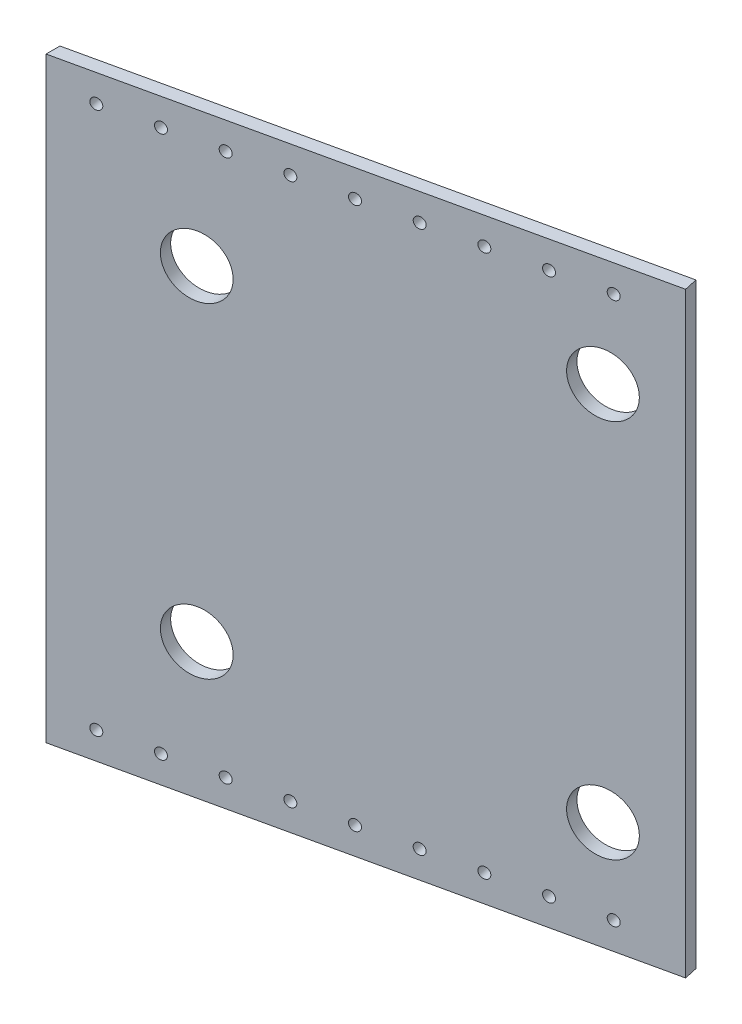
ISO-10303-21;
HEADER;
FILE_DESCRIPTION(('STEP AP214'),'2;1');
FILE_NAME('part.step','',(''),(''),'','','');
FILE_SCHEMA(('AUTOMOTIVE_DESIGN { 1 0 10303 214 1 1 1 1 }'));
ENDSEC;
DATA;
#1=APPLICATION_CONTEXT('core data for automotive mechanical design processes');
#2=APPLICATION_PROTOCOL_DEFINITION('international standard','automotive_design',2000,#1);
#3=PRODUCT_CONTEXT('',#1,'mechanical');
#4=PRODUCT('Part','Part','',(#3));
#5=PRODUCT_RELATED_PRODUCT_CATEGORY('part','',(#4));
#6=PRODUCT_DEFINITION_FORMATION('','',#4);
#7=PRODUCT_DEFINITION_CONTEXT('part definition',#1,'design');
#8=PRODUCT_DEFINITION('design','',#6,#7);
#9=PRODUCT_DEFINITION_SHAPE('','',#8);
#10=(LENGTH_UNIT() NAMED_UNIT(*) SI_UNIT(.MILLI.,.METRE.));
#11=(NAMED_UNIT(*) PLANE_ANGLE_UNIT() SI_UNIT($,.RADIAN.));
#12=(NAMED_UNIT(*) SI_UNIT($,.STERADIAN.) SOLID_ANGLE_UNIT());
#13=UNCERTAINTY_MEASURE_WITH_UNIT(LENGTH_MEASURE(1.E-05),#10,'distance_accuracy_value','');
#14=(GEOMETRIC_REPRESENTATION_CONTEXT(3) GLOBAL_UNCERTAINTY_ASSIGNED_CONTEXT((#13)) GLOBAL_UNIT_ASSIGNED_CONTEXT((#10,
#11,#12)) REPRESENTATION_CONTEXT('',''));
#15=CARTESIAN_POINT('',(0.,0.,0.));
#16=DIRECTION('',(0.,0.,1.));
#17=DIRECTION('',(1.,0.,0.));
#18=AXIS2_PLACEMENT_3D('',#15,#16,#17);
#19=CARTESIAN_POINT('',(472.462608451493,6.35,793.845234641783));
#20=DIRECTION('',(0.,-1.,0.));
#21=DIRECTION('',(0.,0.,-1.));
#22=AXIS2_PLACEMENT_3D('',#19,#20,#21);
#23=PLANE('',#22);
#24=DIRECTION('',(0.976296007119933,0.,-0.216439613938103));
#25=VECTOR('',#24,1.);
#26=CARTESIAN_POINT('',(473.837,6.35,800.044714286995));
#27=LINE('',#26,#25);
#28=CARTESIAN_POINT('',(473.837,6.35,800.044714286995));
#29=VERTEX_POINT('',#28);
#30=CARTESIAN_POINT('',(719.074,6.35,745.676980304428));
#31=VERTEX_POINT('',#30);
#32=EDGE_CURVE('E100',#29,#31,#27,.T.);
#33=ORIENTED_EDGE('',*,*,#32,.F.);
#34=DIRECTION('',(0.,0.,1.));
#35=VECTOR('',#34,1.);
#36=CARTESIAN_POINT('',(473.837,6.35000000000002,800.044714286995));
#37=LINE('',#36,#35);
#38=CARTESIAN_POINT('',(473.837,6.35,793.540539371097));
#39=VERTEX_POINT('',#38);
#40=EDGE_CURVE('E11',#39,#29,#37,.T.);
#41=ORIENTED_EDGE('',*,*,#40,.F.);
#42=DIRECTION('',(0.976296007119933,0.,-0.216439613938103));
#43=VECTOR('',#42,1.);
#44=CARTESIAN_POINT('',(472.462608451493,6.35,793.845234641783));
#45=LINE('',#44,#43);
#46=CARTESIAN_POINT('',(717.699608451493,6.35,739.477500659216));
#47=VERTEX_POINT('',#46);
#48=EDGE_CURVE('E296',#39,#47,#45,.T.);
#49=ORIENTED_EDGE('',*,*,#48,.T.);
#50=DIRECTION('',(0.216439613938103,0.,0.976296007119933));
#51=VECTOR('',#50,1.);
#52=CARTESIAN_POINT('',(717.699608451493,6.35,739.477500659216));
#53=LINE('',#52,#51);
#54=EDGE_CURVE('E55',#47,#31,#53,.T.);
#55=ORIENTED_EDGE('',*,*,#54,.T.);
#56=EDGE_LOOP('',(#33,#41,#49,#55));
#57=FACE_BOUND('',#56,.T.);
#58=ADVANCED_FACE('F45',(#57),#23,.T.);
#59=CARTESIAN_POINT('',(473.837,284.48,800.044714286995));
#60=DIRECTION('',(-1.,0.,0.));
#61=DIRECTION('',(0.,0.,1.));
#62=AXIS2_PLACEMENT_3D('',#59,#60,#61);
#63=PLANE('',#62);
#64=DIRECTION('',(0.,-1.,0.));
#65=VECTOR('',#64,1.);
#66=CARTESIAN_POINT('',(473.837,284.48,800.044714286995));
#67=LINE('',#66,#65);
#68=CARTESIAN_POINT('',(473.837,285.75,800.044714286995));
#69=VERTEX_POINT('',#68);
#70=EDGE_CURVE('E80',#69,#29,#67,.T.);
#71=ORIENTED_EDGE('',*,*,#70,.F.);
#72=DIRECTION('',(0.,0.,1.));
#73=VECTOR('',#72,1.);
#74=CARTESIAN_POINT('',(473.837,285.75,800.044714286995));
#75=LINE('',#74,#73);
#76=CARTESIAN_POINT('',(473.837,285.75,793.540539371097));
#77=VERTEX_POINT('',#76);
#78=EDGE_CURVE('E112',#77,#69,#75,.T.);
#79=ORIENTED_EDGE('',*,*,#78,.F.);
#80=DIRECTION('',(0.,-1.,0.));
#81=VECTOR('',#80,1.);
#82=CARTESIAN_POINT('',(473.837,0.,793.540539371098));
#83=LINE('',#82,#81);
#84=EDGE_CURVE('E49',#77,#39,#83,.T.);
#85=ORIENTED_EDGE('',*,*,#84,.T.);
#86=ORIENTED_EDGE('',*,*,#40,.T.);
#87=EDGE_LOOP('',(#71,#79,#85,#86));
#88=FACE_BOUND('',#87,.T.);
#89=ADVANCED_FACE('F47',(#88),#63,.T.);
#90=CARTESIAN_POINT('',(717.699608451493,6.35,739.477500659216));
#91=DIRECTION('',(0.976296007119933,0.,-0.216439613938103));
#92=DIRECTION('',(-0.216439613938103,0.,-0.976296007119933));
#93=AXIS2_PLACEMENT_3D('',#90,#91,#92);
#94=PLANE('',#93);
#95=DIRECTION('',(0.,1.,0.));
#96=VECTOR('',#95,1.);
#97=CARTESIAN_POINT('',(719.074,6.35,745.676980304428));
#98=LINE('',#97,#96);
#99=CARTESIAN_POINT('',(719.074,285.75,745.676980304428));
#100=VERTEX_POINT('',#99);
#101=EDGE_CURVE('E95',#31,#100,#98,.T.);
#102=ORIENTED_EDGE('',*,*,#101,.F.);
#103=ORIENTED_EDGE('',*,*,#54,.F.);
#104=DIRECTION('',(0.,1.,0.));
#105=VECTOR('',#104,1.);
#106=CARTESIAN_POINT('',(717.699608451493,6.35,739.477500659216));
#107=LINE('',#106,#105);
#108=CARTESIAN_POINT('',(717.699608451493,285.75,739.477500659216));
#109=VERTEX_POINT('',#108);
#110=EDGE_CURVE('E106',#47,#109,#107,.T.);
#111=ORIENTED_EDGE('',*,*,#110,.T.);
#112=DIRECTION('',(-0.216439613938108,0.,-0.976296007119932));
#113=VECTOR('',#112,1.);
#114=CARTESIAN_POINT('',(717.699608451493,285.75,739.477500659216));
#115=LINE('',#114,#113);
#116=EDGE_CURVE('E104',#100,#109,#115,.T.);
#117=ORIENTED_EDGE('',*,*,#116,.F.);
#118=EDGE_LOOP('',(#102,#103,#111,#117));
#119=FACE_BOUND('',#118,.T.);
#120=ADVANCED_FACE('F105',(#119),#94,.T.);
#121=CARTESIAN_POINT('',(189.879780241853,0.,856.492339410407));
#122=DIRECTION('',(0.216439613938103,0.,0.976296007119933));
#123=DIRECTION('',(0.976296007119933,0.,-0.216439613938103));
#124=AXIS2_PLACEMENT_3D('',#121,#122,#123);
#125=PLANE('',#124);
#126=CARTESIAN_POINT('',(541.328908142361,273.05,778.577943564349));
#127=DIRECTION('',(0.216439613938103,0.,0.976296007119933));
#128=DIRECTION('',(0.976296007119933,0.,-0.216439613938103));
#129=AXIS2_PLACEMENT_3D('',#126,#127,#128);
#130=CIRCLE('',#129,2.55270000000035);
#131=CARTESIAN_POINT('',(543.821098959737,273.05,778.025438161849));
#132=VERTEX_POINT('',#131);
#133=EDGE_CURVE('E124',#132,#132,#130,.T.);
#134=ORIENTED_EDGE('',*,*,#133,.T.);
#135=EDGE_LOOP('',(#134));
#136=FACE_BOUND('',#135,.T.);
#137=CARTESIAN_POINT('',(590.924745304054,273.05,767.582811176293));
#138=DIRECTION('',(0.216439613938103,0.,0.976296007119933));
#139=DIRECTION('',(0.976296007119933,0.,-0.216439613938103));
#140=AXIS2_PLACEMENT_3D('',#137,#138,#139);
#141=CIRCLE('',#140,2.55270000000035);
#142=CARTESIAN_POINT('',(593.416936121429,273.05,767.030305773793));
#143=VERTEX_POINT('',#142);
#144=EDGE_CURVE('E132',#143,#143,#141,.T.);
#145=ORIENTED_EDGE('',*,*,#144,.T.);
#146=EDGE_LOOP('',(#145));
#147=FACE_BOUND('',#146,.T.);
#148=CARTESIAN_POINT('',(640.520582465747,273.05,756.587678788237));
#149=DIRECTION('',(0.216439613938103,0.,0.976296007119933));
#150=DIRECTION('',(0.976296007119933,0.,-0.216439613938103));
#151=AXIS2_PLACEMENT_3D('',#148,#149,#150);
#152=CIRCLE('',#151,2.55270000000035);
#153=CARTESIAN_POINT('',(643.012773283122,273.05,756.035173385737));
#154=VERTEX_POINT('',#153);
#155=EDGE_CURVE('E140',#154,#154,#152,.T.);
#156=ORIENTED_EDGE('',*,*,#155,.T.);
#157=EDGE_LOOP('',(#156));
#158=FACE_BOUND('',#157,.T.);
#159=CARTESIAN_POINT('',(690.116419627439,273.05,745.592546400182));
#160=DIRECTION('',(0.216439613938103,0.,0.976296007119933));
#161=DIRECTION('',(0.976296007119933,0.,-0.216439613938103));
#162=AXIS2_PLACEMENT_3D('',#159,#160,#161);
#163=CIRCLE('',#162,2.55270000000035);
#164=CARTESIAN_POINT('',(692.608610444815,273.05,745.040040997682));
#165=VERTEX_POINT('',#164);
#166=EDGE_CURVE('E148',#165,#165,#163,.T.);
#167=ORIENTED_EDGE('',*,*,#166,.T.);
#168=EDGE_LOOP('',(#167));
#169=FACE_BOUND('',#168,.T.);
#170=CARTESIAN_POINT('',(665.318501046593,273.05,751.090112594209));
#171=DIRECTION('',(0.216439613938103,0.,0.976296007119933));
#172=DIRECTION('',(0.976296007119933,0.,-0.216439613938103));
#173=AXIS2_PLACEMENT_3D('',#170,#171,#172);
#174=CIRCLE('',#173,2.55270000000035);
#175=CARTESIAN_POINT('',(667.810691863968,273.05,750.53760719171));
#176=VERTEX_POINT('',#175);
#177=EDGE_CURVE('E156',#176,#176,#174,.T.);
#178=ORIENTED_EDGE('',*,*,#177,.T.);
#179=EDGE_LOOP('',(#178));
#180=FACE_BOUND('',#179,.T.);
#181=CARTESIAN_POINT('',(615.7226638849,273.05,762.085244982265));
#182=DIRECTION('',(0.216439613938103,0.,0.976296007119933));
#183=DIRECTION('',(0.976296007119933,0.,-0.216439613938103));
#184=AXIS2_PLACEMENT_3D('',#181,#182,#183);
#185=CIRCLE('',#184,2.55270000000035);
#186=CARTESIAN_POINT('',(618.214854702276,273.05,761.532739579765));
#187=VERTEX_POINT('',#186);
#188=EDGE_CURVE('E164',#187,#187,#185,.T.);
#189=ORIENTED_EDGE('',*,*,#188,.T.);
#190=EDGE_LOOP('',(#189));
#191=FACE_BOUND('',#190,.T.);
#192=CARTESIAN_POINT('',(566.126826723208,273.05,773.080377370321));
#193=DIRECTION('',(0.216439613938103,0.,0.976296007119933));
#194=DIRECTION('',(0.976296007119933,0.,-0.216439613938103));
#195=AXIS2_PLACEMENT_3D('',#192,#193,#194);
#196=CIRCLE('',#195,2.55270000000035);
#197=CARTESIAN_POINT('',(568.619017540583,273.05,772.527871967821));
#198=VERTEX_POINT('',#197);
#199=EDGE_CURVE('E172',#198,#198,#196,.T.);
#200=ORIENTED_EDGE('',*,*,#199,.T.);
#201=EDGE_LOOP('',(#200));
#202=FACE_BOUND('',#201,.T.);
#203=CARTESIAN_POINT('',(516.530989561515,273.05,784.075509758376));
#204=DIRECTION('',(0.216439613938103,0.,0.976296007119933));
#205=DIRECTION('',(0.976296007119933,0.,-0.216439613938103));
#206=AXIS2_PLACEMENT_3D('',#203,#204,#205);
#207=CIRCLE('',#206,2.55270000000035);
#208=CARTESIAN_POINT('',(519.023180378891,273.05,783.523004355876));
#209=VERTEX_POINT('',#208);
#210=EDGE_CURVE('E180',#209,#209,#207,.T.);
#211=ORIENTED_EDGE('',*,*,#210,.T.);
#212=EDGE_LOOP('',(#211));
#213=FACE_BOUND('',#212,.T.);
#214=CARTESIAN_POINT('',(690.116874131222,19.05,745.592445639119));
#215=DIRECTION('',(0.216439613938103,0.,0.976296007119933));
#216=DIRECTION('',(0.976296007119933,0.,-0.216439613938103));
#217=AXIS2_PLACEMENT_3D('',#214,#215,#216);
#218=CIRCLE('',#217,2.55270000000033);
#219=CARTESIAN_POINT('',(692.609064948597,19.05,745.039940236619));
#220=VERTEX_POINT('',#219);
#221=EDGE_CURVE('E188',#220,#220,#218,.T.);
#222=ORIENTED_EDGE('',*,*,#221,.T.);
#223=EDGE_LOOP('',(#222));
#224=FACE_BOUND('',#223,.T.);
#225=CARTESIAN_POINT('',(665.318955550375,19.05,751.090011833147));
#226=DIRECTION('',(0.216439613938103,0.,0.976296007119933));
#227=DIRECTION('',(0.976296007119933,0.,-0.216439613938103));
#228=AXIS2_PLACEMENT_3D('',#225,#226,#227);
#229=CIRCLE('',#228,2.55270000000033);
#230=CARTESIAN_POINT('',(667.81114636775,19.05,750.537506430647));
#231=VERTEX_POINT('',#230);
#232=EDGE_CURVE('E196',#231,#231,#229,.T.);
#233=ORIENTED_EDGE('',*,*,#232,.T.);
#234=EDGE_LOOP('',(#233));
#235=FACE_BOUND('',#234,.T.);
#236=CARTESIAN_POINT('',(640.521036969529,19.05,756.587578027175));
#237=DIRECTION('',(0.216439613938103,0.,0.976296007119933));
#238=DIRECTION('',(0.976296007119933,0.,-0.216439613938103));
#239=AXIS2_PLACEMENT_3D('',#236,#237,#238);
#240=CIRCLE('',#239,2.55270000000033);
#241=CARTESIAN_POINT('',(643.013227786904,19.05,756.035072624675));
#242=VERTEX_POINT('',#241);
#243=EDGE_CURVE('E204',#242,#242,#240,.T.);
#244=ORIENTED_EDGE('',*,*,#243,.T.);
#245=EDGE_LOOP('',(#244));
#246=FACE_BOUND('',#245,.T.);
#247=CARTESIAN_POINT('',(615.723118388683,19.05,762.085144221202));
#248=DIRECTION('',(0.216439613938103,0.,0.976296007119933));
#249=DIRECTION('',(0.976296007119933,0.,-0.216439613938103));
#250=AXIS2_PLACEMENT_3D('',#247,#248,#249);
#251=CIRCLE('',#250,2.55270000000033);
#252=CARTESIAN_POINT('',(618.215309206058,19.05,761.532638818702));
#253=VERTEX_POINT('',#252);
#254=EDGE_CURVE('E212',#253,#253,#251,.T.);
#255=ORIENTED_EDGE('',*,*,#254,.T.);
#256=EDGE_LOOP('',(#255));
#257=FACE_BOUND('',#256,.T.);
#258=CARTESIAN_POINT('',(590.925199807837,19.05,767.58271041523));
#259=DIRECTION('',(0.216439613938103,0.,0.976296007119933));
#260=DIRECTION('',(0.976296007119933,0.,-0.216439613938103));
#261=AXIS2_PLACEMENT_3D('',#258,#259,#260);
#262=CIRCLE('',#261,2.55270000000033);
#263=CARTESIAN_POINT('',(593.417390625212,19.05,767.03020501273));
#264=VERTEX_POINT('',#263);
#265=EDGE_CURVE('E220',#264,#264,#262,.T.);
#266=ORIENTED_EDGE('',*,*,#265,.T.);
#267=EDGE_LOOP('',(#266));
#268=FACE_BOUND('',#267,.T.);
#269=CARTESIAN_POINT('',(566.12728122699,19.05,773.080276609258));
#270=DIRECTION('',(0.216439613938103,0.,0.976296007119933));
#271=DIRECTION('',(0.976296007119933,0.,-0.216439613938103));
#272=AXIS2_PLACEMENT_3D('',#269,#270,#271);
#273=CIRCLE('',#272,2.55270000000033);
#274=CARTESIAN_POINT('',(568.619472044365,19.05,772.527771206758));
#275=VERTEX_POINT('',#274);
#276=EDGE_CURVE('E228',#275,#275,#273,.T.);
#277=ORIENTED_EDGE('',*,*,#276,.T.);
#278=EDGE_LOOP('',(#277));
#279=FACE_BOUND('',#278,.T.);
#280=CARTESIAN_POINT('',(541.329362646144,19.05,778.577842803286));
#281=DIRECTION('',(0.216439613938103,0.,0.976296007119933));
#282=DIRECTION('',(0.976296007119933,0.,-0.216439613938103));
#283=AXIS2_PLACEMENT_3D('',#280,#281,#282);
#284=CIRCLE('',#283,2.55270000000033);
#285=CARTESIAN_POINT('',(543.821553463519,19.05,778.025337400786));
#286=VERTEX_POINT('',#285);
#287=EDGE_CURVE('E236',#286,#286,#284,.T.);
#288=ORIENTED_EDGE('',*,*,#287,.T.);
#289=EDGE_LOOP('',(#288));
#290=FACE_BOUND('',#289,.T.);
#291=CARTESIAN_POINT('',(516.531444065298,19.05,784.075408997314));
#292=DIRECTION('',(0.216439613938103,0.,0.976296007119933));
#293=DIRECTION('',(0.976296007119933,0.,-0.216439613938103));
#294=AXIS2_PLACEMENT_3D('',#291,#292,#293);
#295=CIRCLE('',#294,2.55270000000033);
#296=CARTESIAN_POINT('',(519.023634882673,19.05,783.522903594814));
#297=VERTEX_POINT('',#296);
#298=EDGE_CURVE('E244',#297,#297,#295,.T.);
#299=ORIENTED_EDGE('',*,*,#298,.T.);
#300=EDGE_LOOP('',(#299));
#301=FACE_BOUND('',#300,.T.);
#302=CARTESIAN_POINT('',(491.733525484452,19.05,789.572975191341));
#303=DIRECTION('',(0.216439613938103,0.,0.976296007119933));
#304=DIRECTION('',(0.976296007119933,0.,-0.216439613938103));
#305=AXIS2_PLACEMENT_3D('',#302,#303,#304);
#306=CIRCLE('',#305,2.55270000000033);
#307=CARTESIAN_POINT('',(494.225716301827,19.05,789.020469788841));
#308=VERTEX_POINT('',#307);
#309=EDGE_CURVE('E252',#308,#308,#306,.T.);
#310=ORIENTED_EDGE('',*,*,#309,.T.);
#311=EDGE_LOOP('',(#310));
#312=FACE_BOUND('',#311,.T.);
#313=CARTESIAN_POINT('',(491.733070980669,273.05,789.573075952404));
#314=DIRECTION('',(0.216439613938103,0.,0.976296007119933));
#315=DIRECTION('',(0.976296007119933,0.,-0.216439613938103));
#316=AXIS2_PLACEMENT_3D('',#313,#314,#315);
#317=CIRCLE('',#316,2.55270000000035);
#318=CARTESIAN_POINT('',(494.225261798044,273.05,789.020570549904));
#319=VERTEX_POINT('',#318);
#320=EDGE_CURVE('E260',#319,#319,#317,.T.);
#321=ORIENTED_EDGE('',*,*,#320,.T.);
#322=EDGE_LOOP('',(#321));
#323=FACE_BOUND('',#322,.T.);
#324=CARTESIAN_POINT('',(530.24592419651,222.25,781.034981951301));
#325=DIRECTION('',(0.216439613938103,0.,0.976296007119933));
#326=DIRECTION('',(0.976296007119933,0.,-0.216439613938103));
#327=AXIS2_PLACEMENT_3D('',#324,#325,#326);
#328=CIRCLE('',#327,14.2874999999991);
#329=CARTESIAN_POINT('',(544.194753398235,222.25,777.942600967161));
#330=VERTEX_POINT('',#329);
#331=EDGE_CURVE('E268',#330,#330,#328,.T.);
#332=ORIENTED_EDGE('',*,*,#331,.T.);
#333=EDGE_LOOP('',(#332));
#334=FACE_BOUND('',#333,.T.);
#335=CARTESIAN_POINT('',(686.000296774254,234.95,746.505068867515));
#336=DIRECTION('',(0.216439613938103,0.,0.976296007119933));
#337=DIRECTION('',(0.976296007119933,0.,-0.216439613938103));
#338=AXIS2_PLACEMENT_3D('',#335,#336,#337);
#339=CIRCLE('',#338,14.2874999999991);
#340=CARTESIAN_POINT('',(699.94912597598,234.95,743.412687883375));
#341=VERTEX_POINT('',#340);
#342=EDGE_CURVE('E276',#341,#341,#339,.T.);
#343=ORIENTED_EDGE('',*,*,#342,.T.);
#344=EDGE_LOOP('',(#343));
#345=FACE_BOUND('',#344,.T.);
#346=CARTESIAN_POINT('',(686.000296774254,57.15,746.505068867515));
#347=DIRECTION('',(0.216439613938103,0.,0.976296007119933));
#348=DIRECTION('',(0.976296007119933,0.,-0.216439613938103));
#349=AXIS2_PLACEMENT_3D('',#346,#347,#348);
#350=CIRCLE('',#349,14.2874999999991);
#351=CARTESIAN_POINT('',(699.94912597598,57.15,743.412687883375));
#352=VERTEX_POINT('',#351);
#353=EDGE_CURVE('E284',#352,#352,#350,.T.);
#354=ORIENTED_EDGE('',*,*,#353,.T.);
#355=EDGE_LOOP('',(#354));
#356=FACE_BOUND('',#355,.T.);
#357=CARTESIAN_POINT('',(530.24592419651,69.85,781.034981951301));
#358=DIRECTION('',(0.216439613938103,0.,0.976296007119933));
#359=DIRECTION('',(0.976296007119933,0.,-0.216439613938103));
#360=AXIS2_PLACEMENT_3D('',#357,#358,#359);
#361=CIRCLE('',#360,14.2874999999991);
#362=CARTESIAN_POINT('',(544.194753398235,69.85,777.942600967161));
#363=VERTEX_POINT('',#362);
#364=EDGE_CURVE('E292',#363,#363,#361,.T.);
#365=ORIENTED_EDGE('',*,*,#364,.T.);
#366=EDGE_LOOP('',(#365));
#367=FACE_BOUND('',#366,.T.);
#368=ORIENTED_EDGE('',*,*,#48,.F.);
#369=ORIENTED_EDGE('',*,*,#84,.F.);
#370=DIRECTION('',(-0.976296007119933,0.,0.216439613938103));
#371=VECTOR('',#370,1.);
#372=CARTESIAN_POINT('',(473.837,285.75,793.540539371097));
#373=LINE('',#372,#371);
#374=EDGE_CURVE('E109',#109,#77,#373,.T.);
#375=ORIENTED_EDGE('',*,*,#374,.F.);
#376=ORIENTED_EDGE('',*,*,#110,.F.);
#377=EDGE_LOOP('',(#368,#369,#375,#376));
#378=FACE_BOUND('',#377,.T.);
#379=ADVANCED_FACE('F315',(#136,#147,#158,#169,#180,#191,#202,#213,#224,#235,#246,#257,#268,
#279,#290,#301,#312,#323,#334,#345,#356,#367,#378),#125,.F.);
#380=CARTESIAN_POINT('',(191.25417179036,0.,862.691819055619));
#381=DIRECTION('',(0.216439613938103,0.,0.976296007119933));
#382=DIRECTION('',(0.976296007119933,0.,-0.216439613938103));
#383=AXIS2_PLACEMENT_3D('',#380,#381,#382);
#384=PLANE('',#383);
#385=CARTESIAN_POINT('',(542.703299690868,273.05,784.77742320956));
#386=DIRECTION('',(0.216439613938103,0.,0.976296007119933));
#387=DIRECTION('',(0.976296007119933,0.,-0.216439613938103));
#388=AXIS2_PLACEMENT_3D('',#385,#386,#387);
#389=CIRCLE('',#388,2.55270000000035);
#390=CARTESIAN_POINT('',(545.195490508244,273.05,784.22491780706));
#391=VERTEX_POINT('',#390);
#392=EDGE_CURVE('E120',#391,#391,#389,.T.);
#393=ORIENTED_EDGE('',*,*,#392,.F.);
#394=EDGE_LOOP('',(#393));
#395=FACE_BOUND('',#394,.T.);
#396=CARTESIAN_POINT('',(592.299136852561,273.05,773.782290821505));
#397=DIRECTION('',(0.216439613938103,0.,0.976296007119933));
#398=DIRECTION('',(0.976296007119933,0.,-0.216439613938103));
#399=AXIS2_PLACEMENT_3D('',#396,#397,#398);
#400=CIRCLE('',#399,2.55270000000035);
#401=CARTESIAN_POINT('',(594.791327669936,273.05,773.229785419005));
#402=VERTEX_POINT('',#401);
#403=EDGE_CURVE('E128',#402,#402,#400,.T.);
#404=ORIENTED_EDGE('',*,*,#403,.F.);
#405=EDGE_LOOP('',(#404));
#406=FACE_BOUND('',#405,.T.);
#407=CARTESIAN_POINT('',(641.894974014254,273.05,762.787158433449));
#408=DIRECTION('',(0.216439613938103,0.,0.976296007119933));
#409=DIRECTION('',(0.976296007119933,0.,-0.216439613938103));
#410=AXIS2_PLACEMENT_3D('',#407,#408,#409);
#411=CIRCLE('',#410,2.55270000000035);
#412=CARTESIAN_POINT('',(644.387164831629,273.05,762.234653030949));
#413=VERTEX_POINT('',#412);
#414=EDGE_CURVE('E136',#413,#413,#411,.T.);
#415=ORIENTED_EDGE('',*,*,#414,.F.);
#416=EDGE_LOOP('',(#415));
#417=FACE_BOUND('',#416,.T.);
#418=CARTESIAN_POINT('',(691.490811175946,273.05,751.792026045393));
#419=DIRECTION('',(0.216439613938103,0.,0.976296007119933));
#420=DIRECTION('',(0.976296007119933,0.,-0.216439613938103));
#421=AXIS2_PLACEMENT_3D('',#418,#419,#420);
#422=CIRCLE('',#421,2.55270000000035);
#423=CARTESIAN_POINT('',(693.983001993322,273.05,751.239520642894));
#424=VERTEX_POINT('',#423);
#425=EDGE_CURVE('E144',#424,#424,#422,.T.);
#426=ORIENTED_EDGE('',*,*,#425,.F.);
#427=EDGE_LOOP('',(#426));
#428=FACE_BOUND('',#427,.T.);
#429=CARTESIAN_POINT('',(666.6928925951,273.05,757.289592239421));
#430=DIRECTION('',(0.216439613938103,0.,0.976296007119933));
#431=DIRECTION('',(0.976296007119933,0.,-0.216439613938103));
#432=AXIS2_PLACEMENT_3D('',#429,#430,#431);
#433=CIRCLE('',#432,2.55270000000035);
#434=CARTESIAN_POINT('',(669.185083412475,273.05,756.737086836921));
#435=VERTEX_POINT('',#434);
#436=EDGE_CURVE('E152',#435,#435,#433,.T.);
#437=ORIENTED_EDGE('',*,*,#436,.F.);
#438=EDGE_LOOP('',(#437));
#439=FACE_BOUND('',#438,.T.);
#440=CARTESIAN_POINT('',(617.097055433407,273.05,768.284724627477));
#441=DIRECTION('',(0.216439613938103,0.,0.976296007119933));
#442=DIRECTION('',(0.976296007119933,0.,-0.216439613938103));
#443=AXIS2_PLACEMENT_3D('',#440,#441,#442);
#444=CIRCLE('',#443,2.55270000000035);
#445=CARTESIAN_POINT('',(619.589246250783,273.05,767.732219224977));
#446=VERTEX_POINT('',#445);
#447=EDGE_CURVE('E160',#446,#446,#444,.T.);
#448=ORIENTED_EDGE('',*,*,#447,.F.);
#449=EDGE_LOOP('',(#448));
#450=FACE_BOUND('',#449,.T.);
#451=CARTESIAN_POINT('',(567.501218271715,273.05,779.279857015532));
#452=DIRECTION('',(0.216439613938103,0.,0.976296007119933));
#453=DIRECTION('',(0.976296007119933,0.,-0.216439613938103));
#454=AXIS2_PLACEMENT_3D('',#451,#452,#453);
#455=CIRCLE('',#454,2.55270000000035);
#456=CARTESIAN_POINT('',(569.99340908909,273.05,778.727351613033));
#457=VERTEX_POINT('',#456);
#458=EDGE_CURVE('E168',#457,#457,#455,.T.);
#459=ORIENTED_EDGE('',*,*,#458,.F.);
#460=EDGE_LOOP('',(#459));
#461=FACE_BOUND('',#460,.T.);
#462=CARTESIAN_POINT('',(517.905381110022,273.05,790.274989403588));
#463=DIRECTION('',(0.216439613938103,0.,0.976296007119933));
#464=DIRECTION('',(0.976296007119933,0.,-0.216439613938103));
#465=AXIS2_PLACEMENT_3D('',#462,#463,#464);
#466=CIRCLE('',#465,2.55270000000035);
#467=CARTESIAN_POINT('',(520.397571927398,273.05,789.722484001088));
#468=VERTEX_POINT('',#467);
#469=EDGE_CURVE('E176',#468,#468,#466,.T.);
#470=ORIENTED_EDGE('',*,*,#469,.F.);
#471=EDGE_LOOP('',(#470));
#472=FACE_BOUND('',#471,.T.);
#473=CARTESIAN_POINT('',(691.491265679729,19.05,751.791925284331));
#474=DIRECTION('',(0.216439613938103,0.,0.976296007119933));
#475=DIRECTION('',(0.976296007119933,0.,-0.216439613938103));
#476=AXIS2_PLACEMENT_3D('',#473,#474,#475);
#477=CIRCLE('',#476,2.55270000000033);
#478=CARTESIAN_POINT('',(693.983456497104,19.05,751.239419881831));
#479=VERTEX_POINT('',#478);
#480=EDGE_CURVE('E184',#479,#479,#477,.T.);
#481=ORIENTED_EDGE('',*,*,#480,.F.);
#482=EDGE_LOOP('',(#481));
#483=FACE_BOUND('',#482,.T.);
#484=CARTESIAN_POINT('',(666.693347098882,19.05,757.289491478359));
#485=DIRECTION('',(0.216439613938103,0.,0.976296007119933));
#486=DIRECTION('',(0.976296007119933,0.,-0.216439613938103));
#487=AXIS2_PLACEMENT_3D('',#484,#485,#486);
#488=CIRCLE('',#487,2.55270000000033);
#489=CARTESIAN_POINT('',(669.185537916257,19.05,756.736986075859));
#490=VERTEX_POINT('',#489);
#491=EDGE_CURVE('E192',#490,#490,#488,.T.);
#492=ORIENTED_EDGE('',*,*,#491,.F.);
#493=EDGE_LOOP('',(#492));
#494=FACE_BOUND('',#493,.T.);
#495=CARTESIAN_POINT('',(641.895428518036,19.05,762.787057672386));
#496=DIRECTION('',(0.216439613938103,0.,0.976296007119933));
#497=DIRECTION('',(0.976296007119933,0.,-0.216439613938103));
#498=AXIS2_PLACEMENT_3D('',#495,#496,#497);
#499=CIRCLE('',#498,2.55270000000033);
#500=CARTESIAN_POINT('',(644.387619335411,19.05,762.234552269886));
#501=VERTEX_POINT('',#500);
#502=EDGE_CURVE('E200',#501,#501,#499,.T.);
#503=ORIENTED_EDGE('',*,*,#502,.F.);
#504=EDGE_LOOP('',(#503));
#505=FACE_BOUND('',#504,.T.);
#506=CARTESIAN_POINT('',(617.09750993719,19.05,768.284623866414));
#507=DIRECTION('',(0.216439613938103,0.,0.976296007119933));
#508=DIRECTION('',(0.976296007119933,0.,-0.216439613938103));
#509=AXIS2_PLACEMENT_3D('',#506,#507,#508);
#510=CIRCLE('',#509,2.55270000000033);
#511=CARTESIAN_POINT('',(619.589700754565,19.05,767.732118463914));
#512=VERTEX_POINT('',#511);
#513=EDGE_CURVE('E208',#512,#512,#510,.T.);
#514=ORIENTED_EDGE('',*,*,#513,.F.);
#515=EDGE_LOOP('',(#514));
#516=FACE_BOUND('',#515,.T.);
#517=CARTESIAN_POINT('',(592.299591356344,19.05,773.782190060442));
#518=DIRECTION('',(0.216439613938103,0.,0.976296007119933));
#519=DIRECTION('',(0.976296007119933,0.,-0.216439613938103));
#520=AXIS2_PLACEMENT_3D('',#517,#518,#519);
#521=CIRCLE('',#520,2.55270000000033);
#522=CARTESIAN_POINT('',(594.791782173719,19.05,773.229684657942));
#523=VERTEX_POINT('',#522);
#524=EDGE_CURVE('E216',#523,#523,#521,.T.);
#525=ORIENTED_EDGE('',*,*,#524,.F.);
#526=EDGE_LOOP('',(#525));
#527=FACE_BOUND('',#526,.T.);
#528=CARTESIAN_POINT('',(567.501672775497,19.05,779.27975625447));
#529=DIRECTION('',(0.216439613938103,0.,0.976296007119933));
#530=DIRECTION('',(0.976296007119933,0.,-0.216439613938103));
#531=AXIS2_PLACEMENT_3D('',#528,#529,#530);
#532=CIRCLE('',#531,2.55270000000033);
#533=CARTESIAN_POINT('',(569.993863592872,19.05,778.72725085197));
#534=VERTEX_POINT('',#533);
#535=EDGE_CURVE('E224',#534,#534,#532,.T.);
#536=ORIENTED_EDGE('',*,*,#535,.F.);
#537=EDGE_LOOP('',(#536));
#538=FACE_BOUND('',#537,.T.);
#539=CARTESIAN_POINT('',(542.703754194651,19.05,784.777322448498));
#540=DIRECTION('',(0.216439613938103,0.,0.976296007119933));
#541=DIRECTION('',(0.976296007119933,0.,-0.216439613938103));
#542=AXIS2_PLACEMENT_3D('',#539,#540,#541);
#543=CIRCLE('',#542,2.55270000000033);
#544=CARTESIAN_POINT('',(545.195945012026,19.05,784.224817045998));
#545=VERTEX_POINT('',#544);
#546=EDGE_CURVE('E232',#545,#545,#543,.T.);
#547=ORIENTED_EDGE('',*,*,#546,.F.);
#548=EDGE_LOOP('',(#547));
#549=FACE_BOUND('',#548,.T.);
#550=CARTESIAN_POINT('',(517.905835613805,19.05,790.274888642525));
#551=DIRECTION('',(0.216439613938103,0.,0.976296007119933));
#552=DIRECTION('',(0.976296007119933,0.,-0.216439613938103));
#553=AXIS2_PLACEMENT_3D('',#550,#551,#552);
#554=CIRCLE('',#553,2.55270000000033);
#555=CARTESIAN_POINT('',(520.39802643118,19.05,789.722383240025));
#556=VERTEX_POINT('',#555);
#557=EDGE_CURVE('E240',#556,#556,#554,.T.);
#558=ORIENTED_EDGE('',*,*,#557,.F.);
#559=EDGE_LOOP('',(#558));
#560=FACE_BOUND('',#559,.T.);
#561=CARTESIAN_POINT('',(493.107917032959,19.05,795.772454836553));
#562=DIRECTION('',(0.216439613938103,0.,0.976296007119933));
#563=DIRECTION('',(0.976296007119933,0.,-0.216439613938103));
#564=AXIS2_PLACEMENT_3D('',#561,#562,#563);
#565=CIRCLE('',#564,2.55270000000033);
#566=CARTESIAN_POINT('',(495.600107850334,19.05,795.219949434053));
#567=VERTEX_POINT('',#566);
#568=EDGE_CURVE('E248',#567,#567,#565,.T.);
#569=ORIENTED_EDGE('',*,*,#568,.F.);
#570=EDGE_LOOP('',(#569));
#571=FACE_BOUND('',#570,.T.);
#572=CARTESIAN_POINT('',(493.107462529176,273.05,795.772555597616));
#573=DIRECTION('',(0.216439613938103,0.,0.976296007119933));
#574=DIRECTION('',(0.976296007119933,0.,-0.216439613938103));
#575=AXIS2_PLACEMENT_3D('',#572,#573,#574);
#576=CIRCLE('',#575,2.55270000000035);
#577=CARTESIAN_POINT('',(495.599653346551,273.05,795.220050195116));
#578=VERTEX_POINT('',#577);
#579=EDGE_CURVE('E256',#578,#578,#576,.T.);
#580=ORIENTED_EDGE('',*,*,#579,.F.);
#581=EDGE_LOOP('',(#580));
#582=FACE_BOUND('',#581,.T.);
#583=CARTESIAN_POINT('',(531.620315745017,222.25,787.234461596514));
#584=DIRECTION('',(0.2164396139381,0.,0.976296007119934));
#585=DIRECTION('',(0.976296007119934,0.,-0.2164396139381));
#586=AXIS2_PLACEMENT_3D('',#583,#584,#585);
#587=CIRCLE('',#586,14.2874999999991);
#588=CARTESIAN_POINT('',(545.569144946742,222.25,784.142080612374));
#589=VERTEX_POINT('',#588);
#590=EDGE_CURVE('E264',#589,#589,#587,.T.);
#591=ORIENTED_EDGE('',*,*,#590,.F.);
#592=EDGE_LOOP('',(#591));
#593=FACE_BOUND('',#592,.T.);
#594=CARTESIAN_POINT('',(687.374688322762,234.95,752.704548512729));
#595=DIRECTION('',(0.2164396139381,0.,0.976296007119934));
#596=DIRECTION('',(0.976296007119934,0.,-0.2164396139381));
#597=AXIS2_PLACEMENT_3D('',#594,#595,#596);
#598=CIRCLE('',#597,14.2874999999991);
#599=CARTESIAN_POINT('',(701.323517524487,234.95,749.612167528588));
#600=VERTEX_POINT('',#599);
#601=EDGE_CURVE('E272',#600,#600,#598,.T.);
#602=ORIENTED_EDGE('',*,*,#601,.F.);
#603=EDGE_LOOP('',(#602));
#604=FACE_BOUND('',#603,.T.);
#605=CARTESIAN_POINT('',(687.374688322762,57.15,752.704548512729));
#606=DIRECTION('',(0.2164396139381,0.,0.976296007119934));
#607=DIRECTION('',(0.976296007119934,0.,-0.2164396139381));
#608=AXIS2_PLACEMENT_3D('',#605,#606,#607);
#609=CIRCLE('',#608,14.2874999999991);
#610=CARTESIAN_POINT('',(701.323517524487,57.15,749.612167528588));
#611=VERTEX_POINT('',#610);
#612=EDGE_CURVE('E280',#611,#611,#609,.T.);
#613=ORIENTED_EDGE('',*,*,#612,.F.);
#614=EDGE_LOOP('',(#613));
#615=FACE_BOUND('',#614,.T.);
#616=CARTESIAN_POINT('',(531.620315745017,69.85,787.234461596514));
#617=DIRECTION('',(0.2164396139381,0.,0.976296007119934));
#618=DIRECTION('',(0.976296007119934,0.,-0.2164396139381));
#619=AXIS2_PLACEMENT_3D('',#616,#617,#618);
#620=CIRCLE('',#619,14.2874999999991);
#621=CARTESIAN_POINT('',(545.569144946742,69.85,784.142080612374));
#622=VERTEX_POINT('',#621);
#623=EDGE_CURVE('E288',#622,#622,#620,.T.);
#624=ORIENTED_EDGE('',*,*,#623,.F.);
#625=EDGE_LOOP('',(#624));
#626=FACE_BOUND('',#625,.T.);
#627=ORIENTED_EDGE('',*,*,#32,.T.);
#628=ORIENTED_EDGE('',*,*,#101,.T.);
#629=DIRECTION('',(0.976296007119933,0.,-0.216439613938103));
#630=VECTOR('',#629,1.);
#631=CARTESIAN_POINT('',(719.074,285.75,745.676980304428));
#632=LINE('',#631,#630);
#633=EDGE_CURVE('E99',#69,#100,#632,.T.);
#634=ORIENTED_EDGE('',*,*,#633,.F.);
#635=ORIENTED_EDGE('',*,*,#70,.T.);
#636=EDGE_LOOP('',(#627,#628,#634,#635));
#637=FACE_BOUND('',#636,.T.);
#638=ADVANCED_FACE('F97',(#395,#406,#417,#428,#439,#450,#461,#472,#483,#494,#505,#516,#527,#538,
#549,#560,#571,#582,#593,#604,#615,#626,#637),#384,.T.);
#639=CARTESIAN_POINT('',(531.620315745017,69.85,787.234461596514));
#640=DIRECTION('',(0.2164396139381,0.,0.976296007119934));
#641=DIRECTION('',(0.976296007119934,0.,-0.2164396139381));
#642=AXIS2_PLACEMENT_3D('',#639,#640,#641);
#643=CYLINDRICAL_SURFACE('',#642,14.2874999999991);
#644=ORIENTED_EDGE('',*,*,#623,.T.);
#645=EDGE_LOOP('',(#644));
#646=FACE_BOUND('',#645,.T.);
#647=ORIENTED_EDGE('',*,*,#364,.F.);
#648=EDGE_LOOP('',(#647));
#649=FACE_BOUND('',#648,.T.);
#650=ADVANCED_FACE('F318',(#646,#649),#643,.F.);
#651=CARTESIAN_POINT('',(687.374688322762,57.15,752.704548512729));
#652=DIRECTION('',(0.2164396139381,0.,0.976296007119934));
#653=DIRECTION('',(0.976296007119934,0.,-0.2164396139381));
#654=AXIS2_PLACEMENT_3D('',#651,#652,#653);
#655=CYLINDRICAL_SURFACE('',#654,14.2874999999991);
#656=ORIENTED_EDGE('',*,*,#612,.T.);
#657=EDGE_LOOP('',(#656));
#658=FACE_BOUND('',#657,.T.);
#659=ORIENTED_EDGE('',*,*,#353,.F.);
#660=EDGE_LOOP('',(#659));
#661=FACE_BOUND('',#660,.T.);
#662=ADVANCED_FACE('F324',(#658,#661),#655,.F.);
#663=CARTESIAN_POINT('',(687.374688322762,234.95,752.704548512729));
#664=DIRECTION('',(0.2164396139381,0.,0.976296007119934));
#665=DIRECTION('',(0.976296007119934,0.,-0.2164396139381));
#666=AXIS2_PLACEMENT_3D('',#663,#664,#665);
#667=CYLINDRICAL_SURFACE('',#666,14.2874999999991);
#668=ORIENTED_EDGE('',*,*,#601,.T.);
#669=EDGE_LOOP('',(#668));
#670=FACE_BOUND('',#669,.T.);
#671=ORIENTED_EDGE('',*,*,#342,.F.);
#672=EDGE_LOOP('',(#671));
#673=FACE_BOUND('',#672,.T.);
#674=ADVANCED_FACE('F328',(#670,#673),#667,.F.);
#675=CARTESIAN_POINT('',(531.620315745017,222.25,787.234461596514));
#676=DIRECTION('',(0.2164396139381,0.,0.976296007119934));
#677=DIRECTION('',(0.976296007119934,0.,-0.2164396139381));
#678=AXIS2_PLACEMENT_3D('',#675,#676,#677);
#679=CYLINDRICAL_SURFACE('',#678,14.2874999999991);
#680=ORIENTED_EDGE('',*,*,#590,.T.);
#681=EDGE_LOOP('',(#680));
#682=FACE_BOUND('',#681,.T.);
#683=ORIENTED_EDGE('',*,*,#331,.F.);
#684=EDGE_LOOP('',(#683));
#685=FACE_BOUND('',#684,.T.);
#686=ADVANCED_FACE('F332',(#682,#685),#679,.F.);
#687=CARTESIAN_POINT('',(493.107462529176,273.05,795.772555597616));
#688=DIRECTION('',(0.216439613938103,0.,0.976296007119933));
#689=DIRECTION('',(0.976296007119933,0.,-0.216439613938103));
#690=AXIS2_PLACEMENT_3D('',#687,#688,#689);
#691=CYLINDRICAL_SURFACE('',#690,2.55270000000035);
#692=ORIENTED_EDGE('',*,*,#579,.T.);
#693=EDGE_LOOP('',(#692));
#694=FACE_BOUND('',#693,.T.);
#695=ORIENTED_EDGE('',*,*,#320,.F.);
#696=EDGE_LOOP('',(#695));
#697=FACE_BOUND('',#696,.T.);
#698=ADVANCED_FACE('F336',(#694,#697),#691,.F.);
#699=CARTESIAN_POINT('',(493.107917032959,19.05,795.772454836553));
#700=DIRECTION('',(0.216439613938103,0.,0.976296007119933));
#701=DIRECTION('',(0.976296007119933,0.,-0.216439613938103));
#702=AXIS2_PLACEMENT_3D('',#699,#700,#701);
#703=CYLINDRICAL_SURFACE('',#702,2.55270000000033);
#704=ORIENTED_EDGE('',*,*,#568,.T.);
#705=EDGE_LOOP('',(#704));
#706=FACE_BOUND('',#705,.T.);
#707=ORIENTED_EDGE('',*,*,#309,.F.);
#708=EDGE_LOOP('',(#707));
#709=FACE_BOUND('',#708,.T.);
#710=ADVANCED_FACE('F340',(#706,#709),#703,.F.);
#711=CARTESIAN_POINT('',(517.905835613805,19.05,790.274888642525));
#712=DIRECTION('',(0.216439613938103,0.,0.976296007119933));
#713=DIRECTION('',(0.976296007119933,0.,-0.216439613938103));
#714=AXIS2_PLACEMENT_3D('',#711,#712,#713);
#715=CYLINDRICAL_SURFACE('',#714,2.55270000000033);
#716=ORIENTED_EDGE('',*,*,#557,.T.);
#717=EDGE_LOOP('',(#716));
#718=FACE_BOUND('',#717,.T.);
#719=ORIENTED_EDGE('',*,*,#298,.F.);
#720=EDGE_LOOP('',(#719));
#721=FACE_BOUND('',#720,.T.);
#722=ADVANCED_FACE('F344',(#718,#721),#715,.F.);
#723=CARTESIAN_POINT('',(542.703754194651,19.05,784.777322448498));
#724=DIRECTION('',(0.216439613938103,0.,0.976296007119933));
#725=DIRECTION('',(0.976296007119933,0.,-0.216439613938103));
#726=AXIS2_PLACEMENT_3D('',#723,#724,#725);
#727=CYLINDRICAL_SURFACE('',#726,2.55270000000033);
#728=ORIENTED_EDGE('',*,*,#546,.T.);
#729=EDGE_LOOP('',(#728));
#730=FACE_BOUND('',#729,.T.);
#731=ORIENTED_EDGE('',*,*,#287,.F.);
#732=EDGE_LOOP('',(#731));
#733=FACE_BOUND('',#732,.T.);
#734=ADVANCED_FACE('F348',(#730,#733),#727,.F.);
#735=CARTESIAN_POINT('',(567.501672775497,19.05,779.27975625447));
#736=DIRECTION('',(0.216439613938103,0.,0.976296007119933));
#737=DIRECTION('',(0.976296007119933,0.,-0.216439613938103));
#738=AXIS2_PLACEMENT_3D('',#735,#736,#737);
#739=CYLINDRICAL_SURFACE('',#738,2.55270000000033);
#740=ORIENTED_EDGE('',*,*,#535,.T.);
#741=EDGE_LOOP('',(#740));
#742=FACE_BOUND('',#741,.T.);
#743=ORIENTED_EDGE('',*,*,#276,.F.);
#744=EDGE_LOOP('',(#743));
#745=FACE_BOUND('',#744,.T.);
#746=ADVANCED_FACE('F352',(#742,#745),#739,.F.);
#747=CARTESIAN_POINT('',(592.299591356344,19.05,773.782190060442));
#748=DIRECTION('',(0.216439613938103,0.,0.976296007119933));
#749=DIRECTION('',(0.976296007119933,0.,-0.216439613938103));
#750=AXIS2_PLACEMENT_3D('',#747,#748,#749);
#751=CYLINDRICAL_SURFACE('',#750,2.55270000000033);
#752=ORIENTED_EDGE('',*,*,#524,.T.);
#753=EDGE_LOOP('',(#752));
#754=FACE_BOUND('',#753,.T.);
#755=ORIENTED_EDGE('',*,*,#265,.F.);
#756=EDGE_LOOP('',(#755));
#757=FACE_BOUND('',#756,.T.);
#758=ADVANCED_FACE('F356',(#754,#757),#751,.F.);
#759=CARTESIAN_POINT('',(617.09750993719,19.05,768.284623866414));
#760=DIRECTION('',(0.216439613938103,0.,0.976296007119933));
#761=DIRECTION('',(0.976296007119933,0.,-0.216439613938103));
#762=AXIS2_PLACEMENT_3D('',#759,#760,#761);
#763=CYLINDRICAL_SURFACE('',#762,2.55270000000033);
#764=ORIENTED_EDGE('',*,*,#513,.T.);
#765=EDGE_LOOP('',(#764));
#766=FACE_BOUND('',#765,.T.);
#767=ORIENTED_EDGE('',*,*,#254,.F.);
#768=EDGE_LOOP('',(#767));
#769=FACE_BOUND('',#768,.T.);
#770=ADVANCED_FACE('F360',(#766,#769),#763,.F.);
#771=CARTESIAN_POINT('',(641.895428518036,19.05,762.787057672386));
#772=DIRECTION('',(0.216439613938103,0.,0.976296007119933));
#773=DIRECTION('',(0.976296007119933,0.,-0.216439613938103));
#774=AXIS2_PLACEMENT_3D('',#771,#772,#773);
#775=CYLINDRICAL_SURFACE('',#774,2.55270000000033);
#776=ORIENTED_EDGE('',*,*,#502,.T.);
#777=EDGE_LOOP('',(#776));
#778=FACE_BOUND('',#777,.T.);
#779=ORIENTED_EDGE('',*,*,#243,.F.);
#780=EDGE_LOOP('',(#779));
#781=FACE_BOUND('',#780,.T.);
#782=ADVANCED_FACE('F364',(#778,#781),#775,.F.);
#783=CARTESIAN_POINT('',(666.693347098882,19.05,757.289491478359));
#784=DIRECTION('',(0.216439613938103,0.,0.976296007119933));
#785=DIRECTION('',(0.976296007119933,0.,-0.216439613938103));
#786=AXIS2_PLACEMENT_3D('',#783,#784,#785);
#787=CYLINDRICAL_SURFACE('',#786,2.55270000000033);
#788=ORIENTED_EDGE('',*,*,#491,.T.);
#789=EDGE_LOOP('',(#788));
#790=FACE_BOUND('',#789,.T.);
#791=ORIENTED_EDGE('',*,*,#232,.F.);
#792=EDGE_LOOP('',(#791));
#793=FACE_BOUND('',#792,.T.);
#794=ADVANCED_FACE('F368',(#790,#793),#787,.F.);
#795=CARTESIAN_POINT('',(691.491265679729,19.05,751.791925284331));
#796=DIRECTION('',(0.216439613938103,0.,0.976296007119933));
#797=DIRECTION('',(0.976296007119933,0.,-0.216439613938103));
#798=AXIS2_PLACEMENT_3D('',#795,#796,#797);
#799=CYLINDRICAL_SURFACE('',#798,2.55270000000033);
#800=ORIENTED_EDGE('',*,*,#480,.T.);
#801=EDGE_LOOP('',(#800));
#802=FACE_BOUND('',#801,.T.);
#803=ORIENTED_EDGE('',*,*,#221,.F.);
#804=EDGE_LOOP('',(#803));
#805=FACE_BOUND('',#804,.T.);
#806=ADVANCED_FACE('F372',(#802,#805),#799,.F.);
#807=CARTESIAN_POINT('',(517.905381110022,273.05,790.274989403588));
#808=DIRECTION('',(0.216439613938103,0.,0.976296007119933));
#809=DIRECTION('',(0.976296007119933,0.,-0.216439613938103));
#810=AXIS2_PLACEMENT_3D('',#807,#808,#809);
#811=CYLINDRICAL_SURFACE('',#810,2.55270000000035);
#812=ORIENTED_EDGE('',*,*,#469,.T.);
#813=EDGE_LOOP('',(#812));
#814=FACE_BOUND('',#813,.T.);
#815=ORIENTED_EDGE('',*,*,#210,.F.);
#816=EDGE_LOOP('',(#815));
#817=FACE_BOUND('',#816,.T.);
#818=ADVANCED_FACE('F376',(#814,#817),#811,.F.);
#819=CARTESIAN_POINT('',(567.501218271715,273.05,779.279857015532));
#820=DIRECTION('',(0.216439613938103,0.,0.976296007119933));
#821=DIRECTION('',(0.976296007119933,0.,-0.216439613938103));
#822=AXIS2_PLACEMENT_3D('',#819,#820,#821);
#823=CYLINDRICAL_SURFACE('',#822,2.55270000000035);
#824=ORIENTED_EDGE('',*,*,#458,.T.);
#825=EDGE_LOOP('',(#824));
#826=FACE_BOUND('',#825,.T.);
#827=ORIENTED_EDGE('',*,*,#199,.F.);
#828=EDGE_LOOP('',(#827));
#829=FACE_BOUND('',#828,.T.);
#830=ADVANCED_FACE('F380',(#826,#829),#823,.F.);
#831=CARTESIAN_POINT('',(617.097055433407,273.05,768.284724627477));
#832=DIRECTION('',(0.216439613938103,0.,0.976296007119933));
#833=DIRECTION('',(0.976296007119933,0.,-0.216439613938103));
#834=AXIS2_PLACEMENT_3D('',#831,#832,#833);
#835=CYLINDRICAL_SURFACE('',#834,2.55270000000035);
#836=ORIENTED_EDGE('',*,*,#447,.T.);
#837=EDGE_LOOP('',(#836));
#838=FACE_BOUND('',#837,.T.);
#839=ORIENTED_EDGE('',*,*,#188,.F.);
#840=EDGE_LOOP('',(#839));
#841=FACE_BOUND('',#840,.T.);
#842=ADVANCED_FACE('F384',(#838,#841),#835,.F.);
#843=CARTESIAN_POINT('',(666.6928925951,273.05,757.289592239421));
#844=DIRECTION('',(0.216439613938103,0.,0.976296007119933));
#845=DIRECTION('',(0.976296007119933,0.,-0.216439613938103));
#846=AXIS2_PLACEMENT_3D('',#843,#844,#845);
#847=CYLINDRICAL_SURFACE('',#846,2.55270000000035);
#848=ORIENTED_EDGE('',*,*,#436,.T.);
#849=EDGE_LOOP('',(#848));
#850=FACE_BOUND('',#849,.T.);
#851=ORIENTED_EDGE('',*,*,#177,.F.);
#852=EDGE_LOOP('',(#851));
#853=FACE_BOUND('',#852,.T.);
#854=ADVANCED_FACE('F388',(#850,#853),#847,.F.);
#855=CARTESIAN_POINT('',(691.490811175946,273.05,751.792026045393));
#856=DIRECTION('',(0.216439613938103,0.,0.976296007119933));
#857=DIRECTION('',(0.976296007119933,0.,-0.216439613938103));
#858=AXIS2_PLACEMENT_3D('',#855,#856,#857);
#859=CYLINDRICAL_SURFACE('',#858,2.55270000000035);
#860=ORIENTED_EDGE('',*,*,#425,.T.);
#861=EDGE_LOOP('',(#860));
#862=FACE_BOUND('',#861,.T.);
#863=ORIENTED_EDGE('',*,*,#166,.F.);
#864=EDGE_LOOP('',(#863));
#865=FACE_BOUND('',#864,.T.);
#866=ADVANCED_FACE('F392',(#862,#865),#859,.F.);
#867=CARTESIAN_POINT('',(641.894974014254,273.05,762.787158433449));
#868=DIRECTION('',(0.216439613938103,0.,0.976296007119933));
#869=DIRECTION('',(0.976296007119933,0.,-0.216439613938103));
#870=AXIS2_PLACEMENT_3D('',#867,#868,#869);
#871=CYLINDRICAL_SURFACE('',#870,2.55270000000035);
#872=ORIENTED_EDGE('',*,*,#414,.T.);
#873=EDGE_LOOP('',(#872));
#874=FACE_BOUND('',#873,.T.);
#875=ORIENTED_EDGE('',*,*,#155,.F.);
#876=EDGE_LOOP('',(#875));
#877=FACE_BOUND('',#876,.T.);
#878=ADVANCED_FACE('F396',(#874,#877),#871,.F.);
#879=CARTESIAN_POINT('',(592.299136852561,273.05,773.782290821505));
#880=DIRECTION('',(0.216439613938103,0.,0.976296007119933));
#881=DIRECTION('',(0.976296007119933,0.,-0.216439613938103));
#882=AXIS2_PLACEMENT_3D('',#879,#880,#881);
#883=CYLINDRICAL_SURFACE('',#882,2.55270000000035);
#884=ORIENTED_EDGE('',*,*,#403,.T.);
#885=EDGE_LOOP('',(#884));
#886=FACE_BOUND('',#885,.T.);
#887=ORIENTED_EDGE('',*,*,#144,.F.);
#888=EDGE_LOOP('',(#887));
#889=FACE_BOUND('',#888,.T.);
#890=ADVANCED_FACE('F400',(#886,#889),#883,.F.);
#891=CARTESIAN_POINT('',(542.703299690868,273.05,784.77742320956));
#892=DIRECTION('',(0.216439613938103,0.,0.976296007119933));
#893=DIRECTION('',(0.976296007119933,0.,-0.216439613938103));
#894=AXIS2_PLACEMENT_3D('',#891,#892,#893);
#895=CYLINDRICAL_SURFACE('',#894,2.55270000000035);
#896=ORIENTED_EDGE('',*,*,#392,.T.);
#897=EDGE_LOOP('',(#896));
#898=FACE_BOUND('',#897,.T.);
#899=ORIENTED_EDGE('',*,*,#133,.F.);
#900=EDGE_LOOP('',(#899));
#901=FACE_BOUND('',#900,.T.);
#902=ADVANCED_FACE('F404',(#898,#901),#895,.F.);
#903=CARTESIAN_POINT('',(0.,285.75,0.));
#904=DIRECTION('',(0.,1.,0.));
#905=DIRECTION('',(0.,0.,1.));
#906=AXIS2_PLACEMENT_3D('',#903,#904,#905);
#907=PLANE('',#906);
#908=ORIENTED_EDGE('',*,*,#633,.T.);
#909=ORIENTED_EDGE('',*,*,#116,.T.);
#910=ORIENTED_EDGE('',*,*,#374,.T.);
#911=ORIENTED_EDGE('',*,*,#78,.T.);
#912=EDGE_LOOP('',(#908,#909,#910,#911));
#913=FACE_BOUND('',#912,.T.);
#914=ADVANCED_FACE('F111',(#913),#907,.T.);
#915=CLOSED_SHELL('',(#58,#89,#120,#379,#638,#650,#662,#674,#686,#698,#710,#722,#734,#746,#758,
#770,#782,#794,#806,#818,#830,#842,#854,#866,#878,#890,#902,#914));
#916=MANIFOLD_SOLID_BREP('B2',#915);
#917=ADVANCED_BREP_SHAPE_REPRESENTATION('',(#18,#916),#14);
#918=SHAPE_DEFINITION_REPRESENTATION(#9,#917);
ENDSEC;
END-ISO-10303-21;
